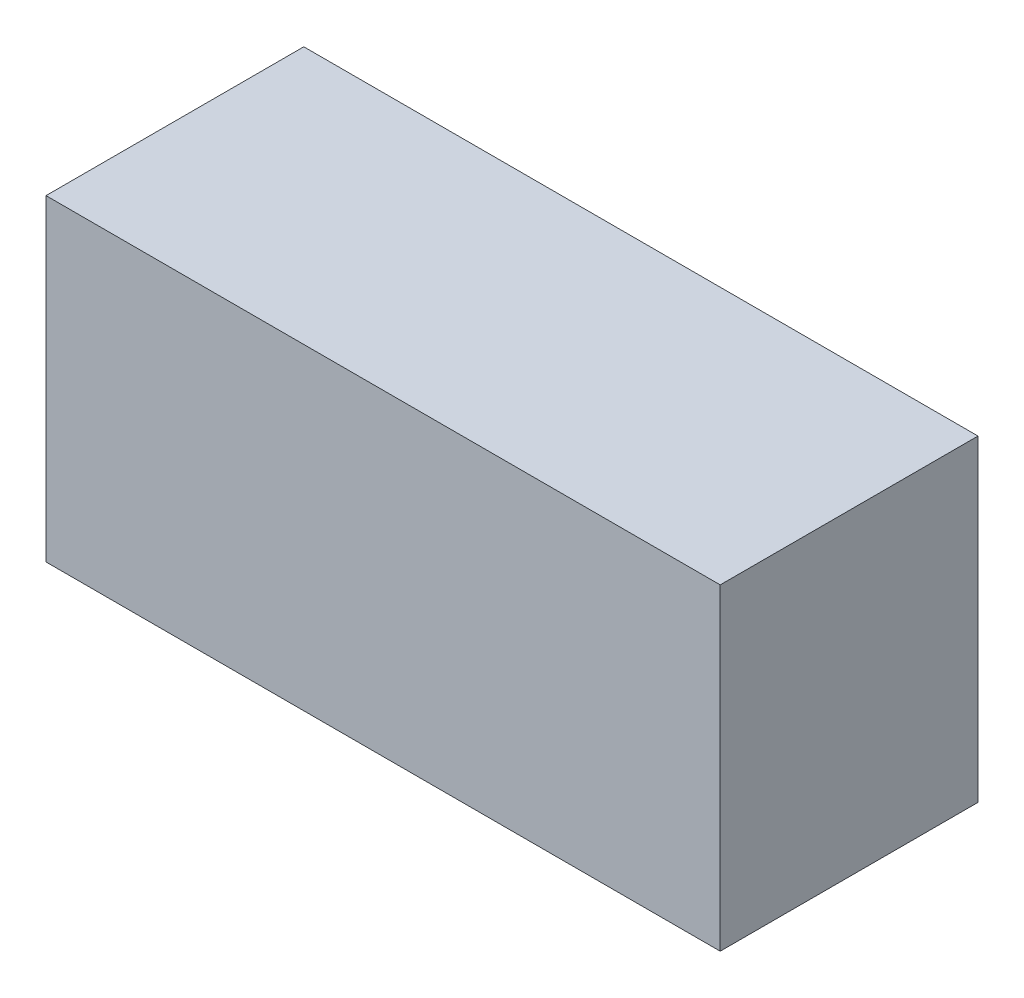
ISO-10303-21;
HEADER;
FILE_DESCRIPTION(('STEP AP214'),'2;1');
FILE_NAME('part.step','',(''),(''),'','','');
FILE_SCHEMA(('AUTOMOTIVE_DESIGN { 1 0 10303 214 1 1 1 1 }'));
ENDSEC;
DATA;
#1=APPLICATION_CONTEXT('core data for automotive mechanical design processes');
#2=APPLICATION_PROTOCOL_DEFINITION('international standard','automotive_design',2000,#1);
#3=PRODUCT_CONTEXT('',#1,'mechanical');
#4=PRODUCT('Part','Part','',(#3));
#5=PRODUCT_RELATED_PRODUCT_CATEGORY('part','',(#4));
#6=PRODUCT_DEFINITION_FORMATION('','',#4);
#7=PRODUCT_DEFINITION_CONTEXT('part definition',#1,'design');
#8=PRODUCT_DEFINITION('design','',#6,#7);
#9=PRODUCT_DEFINITION_SHAPE('','',#8);
#10=(LENGTH_UNIT() NAMED_UNIT(*) SI_UNIT(.MILLI.,.METRE.));
#11=(NAMED_UNIT(*) PLANE_ANGLE_UNIT() SI_UNIT($,.RADIAN.));
#12=(NAMED_UNIT(*) SI_UNIT($,.STERADIAN.) SOLID_ANGLE_UNIT());
#13=UNCERTAINTY_MEASURE_WITH_UNIT(LENGTH_MEASURE(1.E-05),#10,'distance_accuracy_value','');
#14=(GEOMETRIC_REPRESENTATION_CONTEXT(3) GLOBAL_UNCERTAINTY_ASSIGNED_CONTEXT((#13)) GLOBAL_UNIT_ASSIGNED_CONTEXT((#10,
#11,#12)) REPRESENTATION_CONTEXT('',''));
#15=CARTESIAN_POINT('',(0.,0.,0.));
#16=DIRECTION('',(0.,0.,1.));
#17=DIRECTION('',(1.,0.,0.));
#18=AXIS2_PLACEMENT_3D('',#15,#16,#17);
#19=CARTESIAN_POINT('',(0.174980599999997,-0.399999200000001,0.6500114));
#20=DIRECTION('',(1.,0.,0.));
#21=DIRECTION('',(0.,0.,-1.));
#22=AXIS2_PLACEMENT_3D('',#19,#20,#21);
#23=PLANE('',#22);
#24=DIRECTION('',(0.,-1.,0.));
#25=VECTOR('',#24,1.);
#26=CARTESIAN_POINT('',(0.174980599999997,-0.399999200000001,0.));
#27=LINE('',#26,#25);
#28=CARTESIAN_POINT('',(0.174980599999997,0.399999199999998,0.));
#29=VERTEX_POINT('',#28);
#30=CARTESIAN_POINT('',(0.174980599999997,-0.399999200000001,0.));
#31=VERTEX_POINT('',#30);
#32=EDGE_CURVE('E95',#29,#31,#27,.T.);
#33=ORIENTED_EDGE('',*,*,#32,.T.);
#34=DIRECTION('',(0.,0.,-1.));
#35=VECTOR('',#34,1.);
#36=CARTESIAN_POINT('',(0.174980599999997,-0.399999200000001,0.6500114));
#37=LINE('',#36,#35);
#38=CARTESIAN_POINT('',(0.174980599999997,-0.399999200000001,0.6500114));
#39=VERTEX_POINT('',#38);
#40=EDGE_CURVE('E11',#39,#31,#37,.T.);
#41=ORIENTED_EDGE('',*,*,#40,.F.);
#42=DIRECTION('',(0.,-1.,0.));
#43=VECTOR('',#42,1.);
#44=CARTESIAN_POINT('',(0.174980599999997,-0.399999200000001,0.6500114));
#45=LINE('',#44,#43);
#46=CARTESIAN_POINT('',(0.174980599999997,0.399999199999998,0.6500114));
#47=VERTEX_POINT('',#46);
#48=EDGE_CURVE('E83',#47,#39,#45,.T.);
#49=ORIENTED_EDGE('',*,*,#48,.F.);
#50=DIRECTION('',(0.,0.,-1.));
#51=VECTOR('',#50,1.);
#52=CARTESIAN_POINT('',(0.174980599999997,0.399999199999998,0.6500114));
#53=LINE('',#52,#51);
#54=EDGE_CURVE('E91',#47,#29,#53,.T.);
#55=ORIENTED_EDGE('',*,*,#54,.T.);
#56=EDGE_LOOP('',(#33,#41,#49,#55));
#57=FACE_BOUND('',#56,.T.);
#58=ADVANCED_FACE('F32',(#57),#23,.F.);
#59=CARTESIAN_POINT('',(1.8749772,-0.399999200000001,0.6500114));
#60=DIRECTION('',(0.,1.,0.));
#61=DIRECTION('',(0.,0.,1.));
#62=AXIS2_PLACEMENT_3D('',#59,#60,#61);
#63=PLANE('',#62);
#64=DIRECTION('',(1.,0.,0.));
#65=VECTOR('',#64,1.);
#66=CARTESIAN_POINT('',(1.8749772,-0.399999200000001,0.));
#67=LINE('',#66,#65);
#68=CARTESIAN_POINT('',(1.8749772,-0.399999200000001,0.));
#69=VERTEX_POINT('',#68);
#70=EDGE_CURVE('E87',#31,#69,#67,.T.);
#71=ORIENTED_EDGE('',*,*,#70,.T.);
#72=DIRECTION('',(0.,0.,-1.));
#73=VECTOR('',#72,1.);
#74=CARTESIAN_POINT('',(1.8749772,-0.399999200000001,0.6500114));
#75=LINE('',#74,#73);
#76=CARTESIAN_POINT('',(1.8749772,-0.399999200000001,0.6500114));
#77=VERTEX_POINT('',#76);
#78=EDGE_CURVE('E40',#77,#69,#75,.T.);
#79=ORIENTED_EDGE('',*,*,#78,.F.);
#80=DIRECTION('',(1.,0.,0.));
#81=VECTOR('',#80,1.);
#82=CARTESIAN_POINT('',(1.8749772,-0.399999200000001,0.6500114));
#83=LINE('',#82,#81);
#84=EDGE_CURVE('E78',#39,#77,#83,.T.);
#85=ORIENTED_EDGE('',*,*,#84,.F.);
#86=ORIENTED_EDGE('',*,*,#40,.T.);
#87=EDGE_LOOP('',(#71,#79,#85,#86));
#88=FACE_BOUND('',#87,.T.);
#89=ADVANCED_FACE('F86',(#88),#63,.F.);
#90=CARTESIAN_POINT('',(1.8749772,0.399999199999998,0.6500114));
#91=DIRECTION('',(-1.,0.,0.));
#92=DIRECTION('',(0.,0.,1.));
#93=AXIS2_PLACEMENT_3D('',#90,#91,#92);
#94=PLANE('',#93);
#95=DIRECTION('',(0.,1.,0.));
#96=VECTOR('',#95,1.);
#97=CARTESIAN_POINT('',(1.8749772,0.399999199999998,0.));
#98=LINE('',#97,#96);
#99=CARTESIAN_POINT('',(1.8749772,0.399999199999998,0.));
#100=VERTEX_POINT('',#99);
#101=EDGE_CURVE('E65',#69,#100,#98,.T.);
#102=ORIENTED_EDGE('',*,*,#101,.T.);
#103=DIRECTION('',(0.,0.,-1.));
#104=VECTOR('',#103,1.);
#105=CARTESIAN_POINT('',(1.8749772,0.399999199999998,0.6500114));
#106=LINE('',#105,#104);
#107=CARTESIAN_POINT('',(1.8749772,0.399999199999998,0.6500114));
#108=VERTEX_POINT('',#107);
#109=EDGE_CURVE('E88',#108,#100,#106,.T.);
#110=ORIENTED_EDGE('',*,*,#109,.F.);
#111=DIRECTION('',(0.,1.,0.));
#112=VECTOR('',#111,1.);
#113=CARTESIAN_POINT('',(1.8749772,0.399999199999998,0.6500114));
#114=LINE('',#113,#112);
#115=EDGE_CURVE('E81',#77,#108,#114,.T.);
#116=ORIENTED_EDGE('',*,*,#115,.F.);
#117=ORIENTED_EDGE('',*,*,#78,.T.);
#118=EDGE_LOOP('',(#102,#110,#116,#117));
#119=FACE_BOUND('',#118,.T.);
#120=ADVANCED_FACE('F89',(#119),#94,.F.);
#121=CARTESIAN_POINT('',(0.174980599999997,0.399999199999998,0.6500114));
#122=DIRECTION('',(0.,-1.,0.));
#123=DIRECTION('',(0.,0.,-1.));
#124=AXIS2_PLACEMENT_3D('',#121,#122,#123);
#125=PLANE('',#124);
#126=DIRECTION('',(-1.,0.,0.));
#127=VECTOR('',#126,1.);
#128=CARTESIAN_POINT('',(0.174980599999997,0.399999199999998,0.));
#129=LINE('',#128,#127);
#130=EDGE_CURVE('E71',#100,#29,#129,.T.);
#131=ORIENTED_EDGE('',*,*,#130,.T.);
#132=ORIENTED_EDGE('',*,*,#54,.F.);
#133=DIRECTION('',(-1.,0.,0.));
#134=VECTOR('',#133,1.);
#135=CARTESIAN_POINT('',(0.174980599999997,0.399999199999998,0.6500114));
#136=LINE('',#135,#134);
#137=EDGE_CURVE('E48',#108,#47,#136,.T.);
#138=ORIENTED_EDGE('',*,*,#137,.F.);
#139=ORIENTED_EDGE('',*,*,#109,.T.);
#140=EDGE_LOOP('',(#131,#132,#138,#139));
#141=FACE_BOUND('',#140,.T.);
#142=ADVANCED_FACE('F102',(#141),#125,.F.);
#143=CARTESIAN_POINT('',(0.,0.,0.6500114));
#144=DIRECTION('',(0.,0.,-1.));
#145=DIRECTION('',(-1.,0.,0.));
#146=AXIS2_PLACEMENT_3D('',#143,#144,#145);
#147=PLANE('',#146);
#148=ORIENTED_EDGE('',*,*,#48,.T.);
#149=ORIENTED_EDGE('',*,*,#84,.T.);
#150=ORIENTED_EDGE('',*,*,#115,.T.);
#151=ORIENTED_EDGE('',*,*,#137,.T.);
#152=EDGE_LOOP('',(#148,#149,#150,#151));
#153=FACE_BOUND('',#152,.T.);
#154=ADVANCED_FACE('F79',(#153),#147,.F.);
#155=CARTESIAN_POINT('',(0.,0.,0.));
#156=DIRECTION('',(0.,0.,-1.));
#157=DIRECTION('',(-1.,0.,0.));
#158=AXIS2_PLACEMENT_3D('',#155,#156,#157);
#159=PLANE('',#158);
#160=ORIENTED_EDGE('',*,*,#32,.F.);
#161=ORIENTED_EDGE('',*,*,#130,.F.);
#162=ORIENTED_EDGE('',*,*,#101,.F.);
#163=ORIENTED_EDGE('',*,*,#70,.F.);
#164=EDGE_LOOP('',(#160,#161,#162,#163));
#165=FACE_BOUND('',#164,.T.);
#166=ADVANCED_FACE('F105',(#165),#159,.T.);
#167=CLOSED_SHELL('',(#58,#89,#120,#142,#154,#166));
#168=MANIFOLD_SOLID_BREP('B2',#167);
#169=ADVANCED_BREP_SHAPE_REPRESENTATION('',(#18,#168),#14);
#170=SHAPE_DEFINITION_REPRESENTATION(#9,#169);
ENDSEC;
END-ISO-10303-21;
